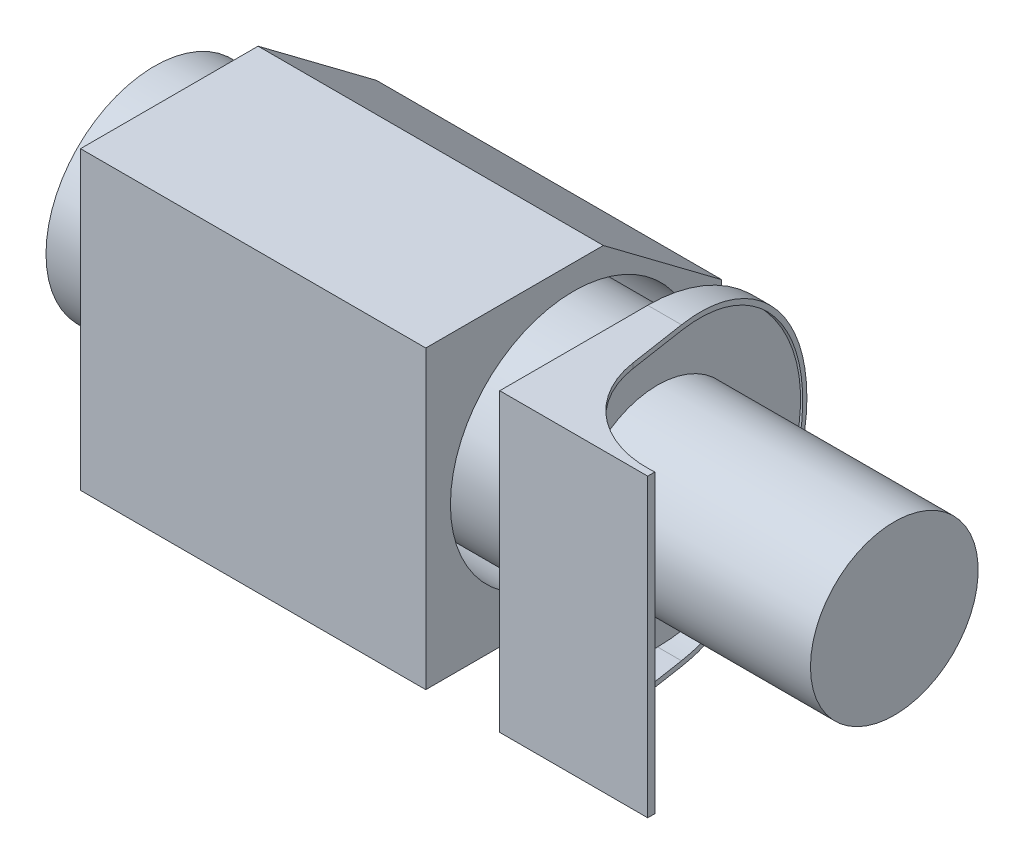
ISO-10303-21;
HEADER;
FILE_DESCRIPTION(('STEP AP214'),'2;1');
FILE_NAME('part.step','',(''),(''),'','','');
FILE_SCHEMA(('AUTOMOTIVE_DESIGN { 1 0 10303 214 1 1 1 1 }'));
ENDSEC;
DATA;
#1=APPLICATION_CONTEXT('core data for automotive mechanical design processes');
#2=APPLICATION_PROTOCOL_DEFINITION('international standard','automotive_design',2000,#1);
#3=PRODUCT_CONTEXT('',#1,'mechanical');
#4=PRODUCT('Part','Part','',(#3));
#5=PRODUCT_RELATED_PRODUCT_CATEGORY('part','',(#4));
#6=PRODUCT_DEFINITION_FORMATION('','',#4);
#7=PRODUCT_DEFINITION_CONTEXT('part definition',#1,'design');
#8=PRODUCT_DEFINITION('design','',#6,#7);
#9=PRODUCT_DEFINITION_SHAPE('','',#8);
#10=(LENGTH_UNIT() NAMED_UNIT(*) SI_UNIT(.MILLI.,.METRE.));
#11=(NAMED_UNIT(*) PLANE_ANGLE_UNIT() SI_UNIT($,.RADIAN.));
#12=(NAMED_UNIT(*) SI_UNIT($,.STERADIAN.) SOLID_ANGLE_UNIT());
#13=UNCERTAINTY_MEASURE_WITH_UNIT(LENGTH_MEASURE(1.E-05),#10,'distance_accuracy_value','');
#14=(GEOMETRIC_REPRESENTATION_CONTEXT(3) GLOBAL_UNCERTAINTY_ASSIGNED_CONTEXT((#13)) GLOBAL_UNIT_ASSIGNED_CONTEXT((#10,
#11,#12)) REPRESENTATION_CONTEXT('',''));
#15=CARTESIAN_POINT('',(0.,0.,0.));
#16=DIRECTION('',(0.,0.,1.));
#17=DIRECTION('',(1.,0.,0.));
#18=AXIS2_PLACEMENT_3D('',#15,#16,#17);
#19=CARTESIAN_POINT('',(-850.,0.,0.));
#20=DIRECTION('',(1.,0.,0.));
#21=DIRECTION('',(0.,0.,-1.));
#22=AXIS2_PLACEMENT_3D('',#19,#20,#21);
#23=PLANE('',#22);
#24=DIRECTION('',(0.,1.,0.));
#25=VECTOR('',#24,1.);
#26=CARTESIAN_POINT('',(-850.,600.,0.));
#27=LINE('',#26,#25);
#28=CARTESIAN_POINT('',(-850.,0.,0.));
#29=VERTEX_POINT('',#28);
#30=CARTESIAN_POINT('',(-850.,600.,0.));
#31=VERTEX_POINT('',#30);
#32=EDGE_CURVE('E140',#29,#31,#27,.T.);
#33=ORIENTED_EDGE('',*,*,#32,.T.);
#34=DIRECTION('',(0.,0.,-1.));
#35=VECTOR('',#34,1.);
#36=CARTESIAN_POINT('',(-850.,600.,0.));
#37=LINE('',#36,#35);
#38=CARTESIAN_POINT('',(-850.,600.,-360.));
#39=VERTEX_POINT('',#38);
#40=EDGE_CURVE('E98',#31,#39,#37,.T.);
#41=ORIENTED_EDGE('',*,*,#40,.T.);
#42=DIRECTION('',(0.,-0.6,-0.8));
#43=VECTOR('',#42,1.);
#44=CARTESIAN_POINT('',(-850.,600.,-360.));
#45=LINE('',#44,#43);
#46=CARTESIAN_POINT('',(-850.,420.,-600.));
#47=VERTEX_POINT('',#46);
#48=EDGE_CURVE('E111',#39,#47,#45,.T.);
#49=ORIENTED_EDGE('',*,*,#48,.T.);
#50=DIRECTION('',(0.,-1.,0.));
#51=VECTOR('',#50,1.);
#52=CARTESIAN_POINT('',(-850.,420.,-600.));
#53=LINE('',#52,#51);
#54=CARTESIAN_POINT('',(-850.,180.,-600.));
#55=VERTEX_POINT('',#54);
#56=EDGE_CURVE('E105',#47,#55,#53,.T.);
#57=ORIENTED_EDGE('',*,*,#56,.T.);
#58=DIRECTION('',(0.,-0.6,0.8));
#59=VECTOR('',#58,1.);
#60=CARTESIAN_POINT('',(-850.,0.,-360.));
#61=LINE('',#60,#59);
#62=CARTESIAN_POINT('',(-850.,0.,-360.));
#63=VERTEX_POINT('',#62);
#64=EDGE_CURVE('E109',#55,#63,#61,.T.);
#65=ORIENTED_EDGE('',*,*,#64,.T.);
#66=DIRECTION('',(0.,0.,1.));
#67=VECTOR('',#66,1.);
#68=CARTESIAN_POINT('',(-850.,0.,0.));
#69=LINE('',#68,#67);
#70=EDGE_CURVE('E61',#63,#29,#69,.T.);
#71=ORIENTED_EDGE('',*,*,#70,.T.);
#72=EDGE_LOOP('',(#33,#41,#49,#57,#65,#71));
#73=FACE_BOUND('',#72,.T.);
#74=CARTESIAN_POINT('',(-850.,300.,-300.));
#75=DIRECTION('',(-1.,0.,0.));
#76=DIRECTION('',(0.,0.,1.));
#77=AXIS2_PLACEMENT_3D('',#74,#75,#76);
#78=CIRCLE('',#77,250.);
#79=CARTESIAN_POINT('',(-850.,300.,-49.9999999999997));
#80=VERTEX_POINT('',#79);
#81=EDGE_CURVE('E133',#80,#80,#78,.T.);
#82=ORIENTED_EDGE('',*,*,#81,.F.);
#83=EDGE_LOOP('',(#82));
#84=FACE_BOUND('',#83,.T.);
#85=ADVANCED_FACE('F44',(#73,#84),#23,.F.);
#86=CARTESIAN_POINT('',(-150.,0.,0.));
#87=DIRECTION('',(1.,0.,0.));
#88=DIRECTION('',(0.,0.,-1.));
#89=AXIS2_PLACEMENT_3D('',#86,#87,#88);
#90=PLANE('',#89);
#91=DIRECTION('',(0.,1.,0.));
#92=VECTOR('',#91,1.);
#93=CARTESIAN_POINT('',(-150.,600.,0.));
#94=LINE('',#93,#92);
#95=CARTESIAN_POINT('',(-150.,0.,0.));
#96=VERTEX_POINT('',#95);
#97=CARTESIAN_POINT('',(-150.,600.,0.));
#98=VERTEX_POINT('',#97);
#99=EDGE_CURVE('E129',#96,#98,#94,.T.);
#100=ORIENTED_EDGE('',*,*,#99,.F.);
#101=DIRECTION('',(0.,0.,1.));
#102=VECTOR('',#101,1.);
#103=CARTESIAN_POINT('',(-150.,0.,0.));
#104=LINE('',#103,#102);
#105=CARTESIAN_POINT('',(-150.,0.,-360.));
#106=VERTEX_POINT('',#105);
#107=EDGE_CURVE('E90',#106,#96,#104,.T.);
#108=ORIENTED_EDGE('',*,*,#107,.F.);
#109=DIRECTION('',(0.,-0.6,0.8));
#110=VECTOR('',#109,1.);
#111=CARTESIAN_POINT('',(-150.,0.,-360.));
#112=LINE('',#111,#110);
#113=CARTESIAN_POINT('',(-150.,180.,-600.));
#114=VERTEX_POINT('',#113);
#115=EDGE_CURVE('E84',#114,#106,#112,.T.);
#116=ORIENTED_EDGE('',*,*,#115,.F.);
#117=DIRECTION('',(0.,-1.,0.));
#118=VECTOR('',#117,1.);
#119=CARTESIAN_POINT('',(-150.,420.,-600.));
#120=LINE('',#119,#118);
#121=CARTESIAN_POINT('',(-150.,420.,-600.));
#122=VERTEX_POINT('',#121);
#123=EDGE_CURVE('E119',#122,#114,#120,.T.);
#124=ORIENTED_EDGE('',*,*,#123,.F.);
#125=DIRECTION('',(0.,-0.6,-0.8));
#126=VECTOR('',#125,1.);
#127=CARTESIAN_POINT('',(-150.,600.,-360.));
#128=LINE('',#127,#126);
#129=CARTESIAN_POINT('',(-150.,600.,-360.));
#130=VERTEX_POINT('',#129);
#131=EDGE_CURVE('E135',#130,#122,#128,.T.);
#132=ORIENTED_EDGE('',*,*,#131,.F.);
#133=DIRECTION('',(0.,0.,-1.));
#134=VECTOR('',#133,1.);
#135=CARTESIAN_POINT('',(-150.,600.,0.));
#136=LINE('',#135,#134);
#137=EDGE_CURVE('E132',#98,#130,#136,.T.);
#138=ORIENTED_EDGE('',*,*,#137,.F.);
#139=EDGE_LOOP('',(#100,#108,#116,#124,#132,#138));
#140=FACE_BOUND('',#139,.T.);
#141=CARTESIAN_POINT('',(-150.,300.,-300.));
#142=DIRECTION('',(-1.,0.,0.));
#143=DIRECTION('',(0.,0.,1.));
#144=AXIS2_PLACEMENT_3D('',#141,#142,#143);
#145=CIRCLE('',#144,250.);
#146=CARTESIAN_POINT('',(-150.,300.,-49.9999999999997));
#147=VERTEX_POINT('',#146);
#148=EDGE_CURVE('E233',#147,#147,#145,.T.);
#149=ORIENTED_EDGE('',*,*,#148,.T.);
#150=EDGE_LOOP('',(#149));
#151=FACE_BOUND('',#150,.T.);
#152=ADVANCED_FACE('F149',(#140,#151),#90,.T.);
#153=CARTESIAN_POINT('',(-850.,600.,0.));
#154=DIRECTION('',(0.,0.,-1.));
#155=DIRECTION('',(-1.,0.,0.));
#156=AXIS2_PLACEMENT_3D('',#153,#154,#155);
#157=PLANE('',#156);
#158=ORIENTED_EDGE('',*,*,#99,.T.);
#159=DIRECTION('',(1.,0.,0.));
#160=VECTOR('',#159,1.);
#161=CARTESIAN_POINT('',(-850.,600.,0.));
#162=LINE('',#161,#160);
#163=EDGE_CURVE('E13',#31,#98,#162,.T.);
#164=ORIENTED_EDGE('',*,*,#163,.F.);
#165=ORIENTED_EDGE('',*,*,#32,.F.);
#166=DIRECTION('',(1.,0.,0.));
#167=VECTOR('',#166,1.);
#168=CARTESIAN_POINT('',(-850.,0.,0.));
#169=LINE('',#168,#167);
#170=EDGE_CURVE('E125',#29,#96,#169,.T.);
#171=ORIENTED_EDGE('',*,*,#170,.T.);
#172=EDGE_LOOP('',(#158,#164,#165,#171));
#173=FACE_BOUND('',#172,.T.);
#174=ADVANCED_FACE('F46',(#173),#157,.F.);
#175=CARTESIAN_POINT('',(-850.,600.,0.));
#176=DIRECTION('',(0.,-1.,0.));
#177=DIRECTION('',(0.,0.,-1.));
#178=AXIS2_PLACEMENT_3D('',#175,#176,#177);
#179=PLANE('',#178);
#180=ORIENTED_EDGE('',*,*,#137,.T.);
#181=DIRECTION('',(1.,0.,0.));
#182=VECTOR('',#181,1.);
#183=CARTESIAN_POINT('',(-850.,600.,-360.));
#184=LINE('',#183,#182);
#185=EDGE_CURVE('E53',#39,#130,#184,.T.);
#186=ORIENTED_EDGE('',*,*,#185,.F.);
#187=ORIENTED_EDGE('',*,*,#40,.F.);
#188=ORIENTED_EDGE('',*,*,#163,.T.);
#189=EDGE_LOOP('',(#180,#186,#187,#188));
#190=FACE_BOUND('',#189,.T.);
#191=ADVANCED_FACE('F174',(#190),#179,.F.);
#192=CARTESIAN_POINT('',(-850.,600.,-360.));
#193=DIRECTION('',(0.,-0.8,0.6));
#194=DIRECTION('',(0.,-0.6,-0.8));
#195=AXIS2_PLACEMENT_3D('',#192,#193,#194);
#196=PLANE('',#195);
#197=ORIENTED_EDGE('',*,*,#131,.T.);
#198=DIRECTION('',(1.,0.,0.));
#199=VECTOR('',#198,1.);
#200=CARTESIAN_POINT('',(-850.,420.,-600.));
#201=LINE('',#200,#199);
#202=EDGE_CURVE('E120',#47,#122,#201,.T.);
#203=ORIENTED_EDGE('',*,*,#202,.F.);
#204=ORIENTED_EDGE('',*,*,#48,.F.);
#205=ORIENTED_EDGE('',*,*,#185,.T.);
#206=EDGE_LOOP('',(#197,#203,#204,#205));
#207=FACE_BOUND('',#206,.T.);
#208=ADVANCED_FACE('F146',(#207),#196,.F.);
#209=CARTESIAN_POINT('',(-850.,420.,-600.));
#210=DIRECTION('',(0.,0.,1.));
#211=DIRECTION('',(0.,-1.,0.));
#212=AXIS2_PLACEMENT_3D('',#209,#210,#211);
#213=PLANE('',#212);
#214=ORIENTED_EDGE('',*,*,#123,.T.);
#215=DIRECTION('',(1.,0.,0.));
#216=VECTOR('',#215,1.);
#217=CARTESIAN_POINT('',(-850.,180.,-600.));
#218=LINE('',#217,#216);
#219=EDGE_CURVE('E116',#55,#114,#218,.T.);
#220=ORIENTED_EDGE('',*,*,#219,.F.);
#221=ORIENTED_EDGE('',*,*,#56,.F.);
#222=ORIENTED_EDGE('',*,*,#202,.T.);
#223=EDGE_LOOP('',(#214,#220,#221,#222));
#224=FACE_BOUND('',#223,.T.);
#225=ADVANCED_FACE('F117',(#224),#213,.F.);
#226=CARTESIAN_POINT('',(-850.,0.,-360.));
#227=DIRECTION('',(0.,0.8,0.6));
#228=DIRECTION('',(0.,-0.6,0.8));
#229=AXIS2_PLACEMENT_3D('',#226,#227,#228);
#230=PLANE('',#229);
#231=ORIENTED_EDGE('',*,*,#115,.T.);
#232=DIRECTION('',(1.,0.,0.));
#233=VECTOR('',#232,1.);
#234=CARTESIAN_POINT('',(-850.,0.,-360.));
#235=LINE('',#234,#233);
#236=EDGE_CURVE('E121',#63,#106,#235,.T.);
#237=ORIENTED_EDGE('',*,*,#236,.F.);
#238=ORIENTED_EDGE('',*,*,#64,.F.);
#239=ORIENTED_EDGE('',*,*,#219,.T.);
#240=EDGE_LOOP('',(#231,#237,#238,#239));
#241=FACE_BOUND('',#240,.T.);
#242=ADVANCED_FACE('F123',(#241),#230,.F.);
#243=CARTESIAN_POINT('',(-850.,0.,0.));
#244=DIRECTION('',(0.,1.,0.));
#245=DIRECTION('',(0.,0.,1.));
#246=AXIS2_PLACEMENT_3D('',#243,#244,#245);
#247=PLANE('',#246);
#248=ORIENTED_EDGE('',*,*,#107,.T.);
#249=ORIENTED_EDGE('',*,*,#170,.F.);
#250=ORIENTED_EDGE('',*,*,#70,.F.);
#251=ORIENTED_EDGE('',*,*,#236,.T.);
#252=EDGE_LOOP('',(#248,#249,#250,#251));
#253=FACE_BOUND('',#252,.T.);
#254=ADVANCED_FACE('F154',(#253),#247,.F.);
#255=CARTESIAN_POINT('',(-850.,300.,-300.));
#256=DIRECTION('',(1.,0.,0.));
#257=DIRECTION('',(0.,0.,-1.));
#258=AXIS2_PLACEMENT_3D('',#255,#256,#257);
#259=CYLINDRICAL_SURFACE('',#258,250.);
#260=ORIENTED_EDGE('',*,*,#81,.T.);
#261=EDGE_LOOP('',(#260));
#262=FACE_BOUND('',#261,.T.);
#263=ORIENTED_EDGE('',*,*,#148,.F.);
#264=EDGE_LOOP('',(#263));
#265=FACE_BOUND('',#264,.T.);
#266=ADVANCED_FACE('F156',(#262,#265),#259,.F.);
#267=CLOSED_SHELL('',(#85,#152,#174,#191,#208,#225,#242,#254,#266));
#268=MANIFOLD_SOLID_BREP('B2',#267);
#269=CARTESIAN_POINT('',(283.937651073963,600.,-213.94835788643));
#270=DIRECTION('',(0.,-1.,0.));
#271=DIRECTION('',(0.,0.,-1.));
#272=AXIS2_PLACEMENT_3D('',#269,#270,#271);
#273=CYLINDRICAL_SURFACE('',#272,200.);
#274=DIRECTION('',(0.,-1.,0.));
#275=VECTOR('',#274,1.);
#276=CARTESIAN_POINT('',(268.9388681595,600.,-14.5115595991412));
#277=LINE('',#276,#275);
#278=CARTESIAN_POINT('',(268.9388681595,10.,-14.5115595991412));
#279=VERTEX_POINT('',#278);
#280=CARTESIAN_POINT('',(268.9388681595,590.,-14.5115595991412));
#281=VERTEX_POINT('',#280);
#282=EDGE_CURVE('E347',#279,#281,#277,.F.);
#283=ORIENTED_EDGE('',*,*,#282,.T.);
#284=CARTESIAN_POINT('',(283.937651073963,590.,-213.94835788643));
#285=DIRECTION('',(0.,1.,0.));
#286=DIRECTION('',(0.,0.,1.));
#287=AXIS2_PLACEMENT_3D('',#284,#285,#286);
#288=CIRCLE('',#287,200.);
#289=CARTESIAN_POINT('',(86.2213483713176,590.,-183.810945164105));
#290=VERTEX_POINT('',#289);
#291=EDGE_CURVE('E366',#281,#290,#288,.F.);
#292=ORIENTED_EDGE('',*,*,#291,.T.);
#293=DIRECTION('',(0.,1.,0.));
#294=VECTOR('',#293,1.);
#295=CARTESIAN_POINT('',(86.2213483713176,600.,-183.810945164105));
#296=LINE('',#295,#294);
#297=CARTESIAN_POINT('',(86.2213483713176,600.,-183.810945164105));
#298=VERTEX_POINT('',#297);
#299=EDGE_CURVE('E465',#298,#290,#296,.F.);
#300=ORIENTED_EDGE('',*,*,#299,.F.);
#301=CARTESIAN_POINT('',(283.937651073963,600.,-213.94835788643));
#302=DIRECTION('',(0.,-1.,0.));
#303=DIRECTION('',(0.,0.,-1.));
#304=AXIS2_PLACEMENT_3D('',#301,#302,#303);
#305=CIRCLE('',#304,200.);
#306=CARTESIAN_POINT('',(291.234636381852,600.,-14.081517201397));
#307=VERTEX_POINT('',#306);
#308=EDGE_CURVE('E263',#298,#307,#305,.F.);
#309=ORIENTED_EDGE('',*,*,#308,.T.);
#310=DIRECTION('',(0.,-1.,0.));
#311=VECTOR('',#310,1.);
#312=CARTESIAN_POINT('',(291.234636381852,0.,-14.081517201397));
#313=LINE('',#312,#311);
#314=CARTESIAN_POINT('',(291.234636381852,0.,-14.081517201397));
#315=VERTEX_POINT('',#314);
#316=EDGE_CURVE('E468',#315,#307,#313,.F.);
#317=ORIENTED_EDGE('',*,*,#316,.F.);
#318=CARTESIAN_POINT('',(283.937651073963,0.,-213.94835788643));
#319=DIRECTION('',(0.,-1.,0.));
#320=DIRECTION('',(0.,0.,-1.));
#321=AXIS2_PLACEMENT_3D('',#318,#319,#320);
#322=CIRCLE('',#321,200.);
#323=CARTESIAN_POINT('',(86.2213483713176,0.,-183.810945164105));
#324=VERTEX_POINT('',#323);
#325=EDGE_CURVE('E381',#315,#324,#322,.T.);
#326=ORIENTED_EDGE('',*,*,#325,.T.);
#327=CARTESIAN_POINT('',(86.2213483713176,10.,-183.810945164105));
#328=VERTEX_POINT('',#327);
#329=EDGE_CURVE('E464',#328,#324,#296,.F.);
#330=ORIENTED_EDGE('',*,*,#329,.F.);
#331=CARTESIAN_POINT('',(283.937651073963,10.,-213.94835788643));
#332=DIRECTION('',(0.,-1.,0.));
#333=DIRECTION('',(0.,0.,-1.));
#334=AXIS2_PLACEMENT_3D('',#331,#332,#333);
#335=CIRCLE('',#334,200.);
#336=EDGE_CURVE('E255',#328,#279,#335,.F.);
#337=ORIENTED_EDGE('',*,*,#336,.T.);
#338=EDGE_LOOP('',(#283,#292,#300,#309,#317,#326,#330,#337));
#339=FACE_BOUND('',#338,.T.);
#340=ADVANCED_FACE('F241',(#339),#273,.F.);
#341=CARTESIAN_POINT('',(0.,600.,0.));
#342=DIRECTION('',(-1.,0.,0.));
#343=DIRECTION('',(0.,0.,1.));
#344=AXIS2_PLACEMENT_3D('',#341,#342,#343);
#345=PLANE('',#344);
#346=CARTESIAN_POINT('',(0.,300.,-300.));
#347=DIRECTION('',(-1.,0.,0.));
#348=DIRECTION('',(0.,0.,1.));
#349=AXIS2_PLACEMENT_3D('',#346,#347,#348);
#350=CIRCLE('',#349,220.);
#351=CARTESIAN_POINT('',(0.,300.,-79.9999999999997));
#352=VERTEX_POINT('',#351);
#353=EDGE_CURVE('E377',#352,#352,#350,.T.);
#354=ORIENTED_EDGE('',*,*,#353,.F.);
#355=EDGE_LOOP('',(#354));
#356=FACE_BOUND('',#355,.T.);
#357=DIRECTION('',(0.,0.,-1.));
#358=VECTOR('',#357,1.);
#359=CARTESIAN_POINT('',(0.,600.,0.));
#360=LINE('',#359,#358);
#361=CARTESIAN_POINT('',(0.,600.,0.));
#362=VERTEX_POINT('',#361);
#363=CARTESIAN_POINT('',(0.,600.,-300.));
#364=VERTEX_POINT('',#363);
#365=EDGE_CURVE('E432',#362,#364,#360,.T.);
#366=ORIENTED_EDGE('',*,*,#365,.T.);
#367=CARTESIAN_POINT('',(0.,300.,-300.));
#368=DIRECTION('',(-1.,0.,0.));
#369=DIRECTION('',(0.,0.,1.));
#370=AXIS2_PLACEMENT_3D('',#367,#368,#369);
#371=CIRCLE('',#370,300.);
#372=CARTESIAN_POINT('',(0.,0.,-300.));
#373=VERTEX_POINT('',#372);
#374=EDGE_CURVE('E435',#364,#373,#371,.T.);
#375=ORIENTED_EDGE('',*,*,#374,.T.);
#376=DIRECTION('',(0.,0.,-1.));
#377=VECTOR('',#376,1.);
#378=CARTESIAN_POINT('',(0.,0.,0.));
#379=LINE('',#378,#377);
#380=CARTESIAN_POINT('',(0.,0.,0.));
#381=VERTEX_POINT('',#380);
#382=EDGE_CURVE('E453',#381,#373,#379,.T.);
#383=ORIENTED_EDGE('',*,*,#382,.F.);
#384=DIRECTION('',(0.,-1.,0.));
#385=VECTOR('',#384,1.);
#386=CARTESIAN_POINT('',(0.,600.,0.));
#387=LINE('',#386,#385);
#388=EDGE_CURVE('E437',#362,#381,#387,.T.);
#389=ORIENTED_EDGE('',*,*,#388,.F.);
#390=EDGE_LOOP('',(#366,#375,#383,#389));
#391=FACE_BOUND('',#390,.T.);
#392=ADVANCED_FACE('F420',(#356,#391),#345,.T.);
#393=CARTESIAN_POINT('',(300.,600.,0.));
#394=DIRECTION('',(-1.,0.,0.));
#395=DIRECTION('',(0.,0.,1.));
#396=AXIS2_PLACEMENT_3D('',#393,#394,#395);
#397=PLANE('',#396);
#398=DIRECTION('',(0.,0.,-1.));
#399=VECTOR('',#398,1.);
#400=CARTESIAN_POINT('',(300.,0.,0.));
#401=LINE('',#400,#399);
#402=CARTESIAN_POINT('',(300.,0.,0.));
#403=VERTEX_POINT('',#402);
#404=CARTESIAN_POINT('',(300.,0.,-14.5115595991412));
#405=VERTEX_POINT('',#404);
#406=EDGE_CURVE('E445',#403,#405,#401,.T.);
#407=ORIENTED_EDGE('',*,*,#406,.T.);
#408=DIRECTION('',(0.,-1.,0.));
#409=VECTOR('',#408,1.);
#410=CARTESIAN_POINT('',(300.,600.,-14.5115595991412));
#411=LINE('',#410,#409);
#412=CARTESIAN_POINT('',(300.,600.,-14.5115595991412));
#413=VERTEX_POINT('',#412);
#414=EDGE_CURVE('E490',#413,#405,#411,.T.);
#415=ORIENTED_EDGE('',*,*,#414,.F.);
#416=DIRECTION('',(0.,0.,-1.));
#417=VECTOR('',#416,1.);
#418=CARTESIAN_POINT('',(300.,600.,0.));
#419=LINE('',#418,#417);
#420=CARTESIAN_POINT('',(300.,600.,0.));
#421=VERTEX_POINT('',#420);
#422=EDGE_CURVE('E439',#421,#413,#419,.T.);
#423=ORIENTED_EDGE('',*,*,#422,.F.);
#424=DIRECTION('',(0.,-1.,0.));
#425=VECTOR('',#424,1.);
#426=CARTESIAN_POINT('',(300.,600.,0.));
#427=LINE('',#426,#425);
#428=EDGE_CURVE('E452',#421,#403,#427,.T.);
#429=ORIENTED_EDGE('',*,*,#428,.T.);
#430=EDGE_LOOP('',(#407,#415,#423,#429));
#431=FACE_BOUND('',#430,.T.);
#432=ADVANCED_FACE('F417',(#431),#397,.F.);
#433=CARTESIAN_POINT('',(0.,600.,0.));
#434=DIRECTION('',(0.,0.,-1.));
#435=DIRECTION('',(-1.,0.,0.));
#436=AXIS2_PLACEMENT_3D('',#433,#434,#435);
#437=PLANE('',#436);
#438=DIRECTION('',(1.,0.,0.));
#439=VECTOR('',#438,1.);
#440=CARTESIAN_POINT('',(0.,0.,0.));
#441=LINE('',#440,#439);
#442=EDGE_CURVE('E440',#381,#403,#441,.T.);
#443=ORIENTED_EDGE('',*,*,#442,.T.);
#444=ORIENTED_EDGE('',*,*,#428,.F.);
#445=DIRECTION('',(1.,0.,0.));
#446=VECTOR('',#445,1.);
#447=CARTESIAN_POINT('',(0.,600.,0.));
#448=LINE('',#447,#446);
#449=EDGE_CURVE('E443',#362,#421,#448,.T.);
#450=ORIENTED_EDGE('',*,*,#449,.F.);
#451=ORIENTED_EDGE('',*,*,#388,.T.);
#452=EDGE_LOOP('',(#443,#444,#450,#451));
#453=FACE_BOUND('',#452,.T.);
#454=ADVANCED_FACE('F410',(#453),#437,.F.);
#455=CARTESIAN_POINT('',(0.,600.,0.));
#456=DIRECTION('',(0.,-1.,0.));
#457=DIRECTION('',(0.,0.,-1.));
#458=AXIS2_PLACEMENT_3D('',#455,#456,#457);
#459=PLANE('',#458);
#460=ORIENTED_EDGE('',*,*,#308,.F.);
#461=DIRECTION('',(-0.150687063611626,0.,-0.988581513513229));
#462=VECTOR('',#461,1.);
#463=CARTESIAN_POINT('',(97.9148013831669,600.,-107.096121744068));
#464=LINE('',#463,#462);
#465=CARTESIAN_POINT('',(68.5109347557419,600.,-300.));
#466=VERTEX_POINT('',#465);
#467=EDGE_CURVE('E388',#298,#466,#464,.T.);
#468=ORIENTED_EDGE('',*,*,#467,.T.);
#469=DIRECTION('',(-1.,0.,0.));
#470=VECTOR('',#469,1.);
#471=CARTESIAN_POINT('',(300.,600.,-300.));
#472=LINE('',#471,#470);
#473=EDGE_CURVE('E448',#466,#364,#472,.T.);
#474=ORIENTED_EDGE('',*,*,#473,.T.);
#475=ORIENTED_EDGE('',*,*,#365,.F.);
#476=ORIENTED_EDGE('',*,*,#449,.T.);
#477=ORIENTED_EDGE('',*,*,#422,.T.);
#478=CARTESIAN_POINT('',(300.,600.,-14.5115595991412));
#479=CARTESIAN_POINT('',(162.264361076892,600.,-6.0546959837281));
#480=CARTESIAN_POINT('',(97.9148013831669,600.,-107.096121744068));
#481=B_SPLINE_CURVE_WITH_KNOTS('',2,(#478,#479,#480),.UNSPECIFIED.,.F.,.F.,(3,3),(0.,1.),.UNSPECIFIED.);
#482=EDGE_CURVE('E382',#413,#307,#481,.T.);
#483=ORIENTED_EDGE('',*,*,#482,.T.);
#484=EDGE_LOOP('',(#460,#468,#474,#475,#476,#477,#483));
#485=FACE_BOUND('',#484,.T.);
#486=ADVANCED_FACE('F407',(#485),#459,.F.);
#487=CARTESIAN_POINT('',(0.,0.,0.));
#488=DIRECTION('',(0.,-1.,0.));
#489=DIRECTION('',(0.,0.,-1.));
#490=AXIS2_PLACEMENT_3D('',#487,#488,#489);
#491=PLANE('',#490);
#492=CARTESIAN_POINT('',(300.,0.,-14.5115595991412));
#493=CARTESIAN_POINT('',(162.264361076892,0.,-6.0546959837281));
#494=CARTESIAN_POINT('',(97.9148013831669,0.,-107.096121744068));
#495=B_SPLINE_CURVE_WITH_KNOTS('',2,(#492,#493,#494),.UNSPECIFIED.,.F.,.F.,(3,3),(0.,1.),.UNSPECIFIED.);
#496=EDGE_CURVE('E376',#405,#315,#495,.T.);
#497=ORIENTED_EDGE('',*,*,#496,.F.);
#498=ORIENTED_EDGE('',*,*,#406,.F.);
#499=ORIENTED_EDGE('',*,*,#442,.F.);
#500=ORIENTED_EDGE('',*,*,#382,.T.);
#501=DIRECTION('',(-1.,0.,0.));
#502=VECTOR('',#501,1.);
#503=CARTESIAN_POINT('',(300.,0.,-300.));
#504=LINE('',#503,#502);
#505=CARTESIAN_POINT('',(68.5109347557419,0.,-300.));
#506=VERTEX_POINT('',#505);
#507=EDGE_CURVE('E455',#506,#373,#504,.T.);
#508=ORIENTED_EDGE('',*,*,#507,.F.);
#509=DIRECTION('',(-0.150687063611626,0.,-0.988581513513229));
#510=VECTOR('',#509,1.);
#511=CARTESIAN_POINT('',(97.9148013831669,0.,-107.096121744068));
#512=LINE('',#511,#510);
#513=EDGE_CURVE('E389',#324,#506,#512,.T.);
#514=ORIENTED_EDGE('',*,*,#513,.F.);
#515=ORIENTED_EDGE('',*,*,#325,.F.);
#516=EDGE_LOOP('',(#497,#498,#499,#500,#508,#514,#515));
#517=FACE_BOUND('',#516,.T.);
#518=ADVANCED_FACE('F405',(#517),#491,.T.);
#519=CARTESIAN_POINT('',(300.,300.,-300.));
#520=DIRECTION('',(-1.,0.,0.));
#521=DIRECTION('',(0.,0.,1.));
#522=AXIS2_PLACEMENT_3D('',#519,#520,#521);
#523=CYLINDRICAL_SURFACE('',#522,300.);
#524=ORIENTED_EDGE('',*,*,#473,.F.);
#525=CARTESIAN_POINT('',(68.5109347557419,300.,-300.));
#526=DIRECTION('',(-0.988581513513229,0.,0.150687063611626));
#527=DIRECTION('',(-0.150687063611626,0.,-0.988581513513229));
#528=AXIS2_PLACEMENT_3D('',#525,#526,#527);
#529=ELLIPSE('',#528,303.465112283819,300.);
#530=EDGE_CURVE('E459',#506,#466,#529,.F.);
#531=ORIENTED_EDGE('',*,*,#530,.F.);
#532=ORIENTED_EDGE('',*,*,#507,.T.);
#533=ORIENTED_EDGE('',*,*,#374,.F.);
#534=EDGE_LOOP('',(#524,#531,#532,#533));
#535=FACE_BOUND('',#534,.T.);
#536=ADVANCED_FACE('F400',(#535),#523,.T.);
#537=DIRECTION('',(0.,-1.,0.));
#538=VECTOR('',#537,1.);
#539=SURFACE_OF_LINEAR_EXTRUSION('',#481,#538);
#540=ORIENTED_EDGE('',*,*,#496,.T.);
#541=ORIENTED_EDGE('',*,*,#316,.T.);
#542=ORIENTED_EDGE('',*,*,#482,.F.);
#543=ORIENTED_EDGE('',*,*,#414,.T.);
#544=EDGE_LOOP('',(#540,#541,#542,#543));
#545=FACE_BOUND('',#544,.T.);
#546=ADVANCED_FACE('F395',(#545),#539,.F.);
#547=CARTESIAN_POINT('',(97.9148013831669,600.,-107.096121744068));
#548=DIRECTION('',(-0.988581513513229,0.,0.150687063611626));
#549=DIRECTION('',(0.150687063611626,0.,0.988581513513229));
#550=AXIS2_PLACEMENT_3D('',#547,#548,#549);
#551=PLANE('',#550);
#552=ORIENTED_EDGE('',*,*,#299,.T.);
#553=DIRECTION('',(-0.150687063611626,0.,-0.988581513513229));
#554=VECTOR('',#553,1.);
#555=CARTESIAN_POINT('',(97.9148013831669,590.,-107.096121744068));
#556=LINE('',#555,#554);
#557=CARTESIAN_POINT('',(68.5109347557419,590.,-300.));
#558=VERTEX_POINT('',#557);
#559=EDGE_CURVE('E42',#290,#558,#556,.T.);
#560=ORIENTED_EDGE('',*,*,#559,.T.);
#561=CARTESIAN_POINT('',(68.5109347557419,300.,-300.));
#562=DIRECTION('',(-0.988581513513229,0.,0.150687063611626));
#563=DIRECTION('',(0.150687063611626,0.,0.988581513513229));
#564=AXIS2_PLACEMENT_3D('',#561,#562,#563);
#565=ELLIPSE('',#564,293.349608541025,290.);
#566=CARTESIAN_POINT('',(68.5109347557419,10.,-300.));
#567=VERTEX_POINT('',#566);
#568=EDGE_CURVE('E248',#558,#567,#565,.T.);
#569=ORIENTED_EDGE('',*,*,#568,.T.);
#570=DIRECTION('',(0.150687063611626,0.,0.988581513513229));
#571=VECTOR('',#570,1.);
#572=CARTESIAN_POINT('',(97.9148013831669,10.,-107.096121744068));
#573=LINE('',#572,#571);
#574=EDGE_CURVE('E380',#567,#328,#573,.T.);
#575=ORIENTED_EDGE('',*,*,#574,.T.);
#576=ORIENTED_EDGE('',*,*,#329,.T.);
#577=ORIENTED_EDGE('',*,*,#513,.T.);
#578=ORIENTED_EDGE('',*,*,#530,.T.);
#579=ORIENTED_EDGE('',*,*,#467,.F.);
#580=EDGE_LOOP('',(#552,#560,#569,#575,#576,#577,#578,#579));
#581=FACE_BOUND('',#580,.T.);
#582=ADVANCED_FACE('F399',(#581),#551,.F.);
#583=CARTESIAN_POINT('',(-1000.,300.,-300.));
#584=DIRECTION('',(1.,0.,0.));
#585=DIRECTION('',(0.,0.,-1.));
#586=AXIS2_PLACEMENT_3D('',#583,#584,#585);
#587=CYLINDRICAL_SURFACE('',#586,220.);
#588=CARTESIAN_POINT('',(-1000.,300.,-300.));
#589=DIRECTION('',(-1.,0.,0.));
#590=DIRECTION('',(0.,0.,1.));
#591=AXIS2_PLACEMENT_3D('',#588,#589,#590);
#592=CIRCLE('',#591,220.);
#593=CARTESIAN_POINT('',(-1000.,300.,-79.9999999999997));
#594=VERTEX_POINT('',#593);
#595=EDGE_CURVE('E373',#594,#594,#592,.T.);
#596=ORIENTED_EDGE('',*,*,#595,.F.);
#597=EDGE_LOOP('',(#596));
#598=FACE_BOUND('',#597,.T.);
#599=ORIENTED_EDGE('',*,*,#353,.T.);
#600=EDGE_LOOP('',(#599));
#601=FACE_BOUND('',#600,.T.);
#602=ADVANCED_FACE('F523',(#598,#601),#587,.T.);
#603=CARTESIAN_POINT('',(-1000.,300.,-300.));
#604=DIRECTION('',(-1.,0.,0.));
#605=DIRECTION('',(0.,0.,1.));
#606=AXIS2_PLACEMENT_3D('',#603,#604,#605);
#607=PLANE('',#606);
#608=ORIENTED_EDGE('',*,*,#595,.T.);
#609=EDGE_LOOP('',(#608));
#610=FACE_BOUND('',#609,.T.);
#611=ADVANCED_FACE('F508',(#610),#607,.T.);
#612=CARTESIAN_POINT('',(19.9999999999998,300.,-14.5115595991413));
#613=DIRECTION('',(0.,0.,1.));
#614=DIRECTION('',(1.,0.,0.));
#615=AXIS2_PLACEMENT_3D('',#612,#613,#614);
#616=PLANE('',#615);
#617=DIRECTION('',(1.,0.,0.));
#618=VECTOR('',#617,1.);
#619=CARTESIAN_POINT('',(19.9999999999998,10.,-14.5115595991413));
#620=LINE('',#619,#618);
#621=CARTESIAN_POINT('',(19.9999999999998,10.,-14.5115595991413));
#622=VERTEX_POINT('',#621);
#623=EDGE_CURVE('E344',#622,#279,#620,.T.);
#624=ORIENTED_EDGE('',*,*,#623,.F.);
#625=DIRECTION('',(0.,-1.,0.));
#626=VECTOR('',#625,1.);
#627=CARTESIAN_POINT('',(19.9999999999998,300.,-14.5115595991413));
#628=LINE('',#627,#626);
#629=CARTESIAN_POINT('',(19.9999999999998,590.,-14.5115595991413));
#630=VERTEX_POINT('',#629);
#631=EDGE_CURVE('E332',#630,#622,#628,.T.);
#632=ORIENTED_EDGE('',*,*,#631,.F.);
#633=DIRECTION('',(1.,0.,0.));
#634=VECTOR('',#633,1.);
#635=CARTESIAN_POINT('',(19.9999999999998,590.,-14.5115595991413));
#636=LINE('',#635,#634);
#637=EDGE_CURVE('E359',#630,#281,#636,.T.);
#638=ORIENTED_EDGE('',*,*,#637,.T.);
#639=ORIENTED_EDGE('',*,*,#282,.F.);
#640=EDGE_LOOP('',(#624,#632,#638,#639));
#641=FACE_BOUND('',#640,.T.);
#642=ADVANCED_FACE('F345',(#641),#616,.F.);
#643=CARTESIAN_POINT('',(19.9999999999999,590.,-300.));
#644=DIRECTION('',(0.,1.,0.));
#645=DIRECTION('',(0.,0.,1.));
#646=AXIS2_PLACEMENT_3D('',#643,#644,#645);
#647=PLANE('',#646);
#648=ORIENTED_EDGE('',*,*,#637,.F.);
#649=DIRECTION('',(0.,0.,1.));
#650=VECTOR('',#649,1.);
#651=CARTESIAN_POINT('',(19.9999999999999,590.,-300.));
#652=LINE('',#651,#650);
#653=CARTESIAN_POINT('',(19.9999999999999,590.,-300.));
#654=VERTEX_POINT('',#653);
#655=EDGE_CURVE('E339',#654,#630,#652,.T.);
#656=ORIENTED_EDGE('',*,*,#655,.F.);
#657=DIRECTION('',(1.,0.,0.));
#658=VECTOR('',#657,1.);
#659=CARTESIAN_POINT('',(19.9999999999999,590.,-300.));
#660=LINE('',#659,#658);
#661=EDGE_CURVE('E361',#654,#558,#660,.T.);
#662=ORIENTED_EDGE('',*,*,#661,.T.);
#663=ORIENTED_EDGE('',*,*,#559,.F.);
#664=ORIENTED_EDGE('',*,*,#291,.F.);
#665=EDGE_LOOP('',(#648,#656,#662,#663,#664));
#666=FACE_BOUND('',#665,.T.);
#667=ADVANCED_FACE('F479',(#666),#647,.F.);
#668=CARTESIAN_POINT('',(19.9999999999999,300.,-300.));
#669=DIRECTION('',(1.,0.,0.));
#670=DIRECTION('',(0.,0.,-1.));
#671=AXIS2_PLACEMENT_3D('',#668,#669,#670);
#672=CYLINDRICAL_SURFACE('',#671,290.);
#673=ORIENTED_EDGE('',*,*,#661,.F.);
#674=CARTESIAN_POINT('',(19.9999999999999,300.,-300.));
#675=DIRECTION('',(1.,0.,0.));
#676=DIRECTION('',(0.,0.,-1.));
#677=AXIS2_PLACEMENT_3D('',#674,#675,#676);
#678=CIRCLE('',#677,290.);
#679=CARTESIAN_POINT('',(19.9999999999999,10.0000000000001,-300.));
#680=VERTEX_POINT('',#679);
#681=EDGE_CURVE('E353',#680,#654,#678,.T.);
#682=ORIENTED_EDGE('',*,*,#681,.F.);
#683=DIRECTION('',(1.,0.,0.));
#684=VECTOR('',#683,1.);
#685=CARTESIAN_POINT('',(19.9999999999999,10.0000000000001,-300.));
#686=LINE('',#685,#684);
#687=EDGE_CURVE('E348',#680,#567,#686,.T.);
#688=ORIENTED_EDGE('',*,*,#687,.T.);
#689=ORIENTED_EDGE('',*,*,#568,.F.);
#690=EDGE_LOOP('',(#673,#682,#688,#689));
#691=FACE_BOUND('',#690,.T.);
#692=ADVANCED_FACE('F477',(#691),#672,.F.);
#693=CARTESIAN_POINT('',(19.9999999999999,10.,-300.));
#694=DIRECTION('',(0.,-1.,0.));
#695=DIRECTION('',(0.,0.,-1.));
#696=AXIS2_PLACEMENT_3D('',#693,#694,#695);
#697=PLANE('',#696);
#698=ORIENTED_EDGE('',*,*,#574,.F.);
#699=ORIENTED_EDGE('',*,*,#687,.F.);
#700=DIRECTION('',(0.,0.,-1.));
#701=VECTOR('',#700,1.);
#702=CARTESIAN_POINT('',(19.9999999999999,10.,-300.));
#703=LINE('',#702,#701);
#704=EDGE_CURVE('E337',#622,#680,#703,.T.);
#705=ORIENTED_EDGE('',*,*,#704,.F.);
#706=ORIENTED_EDGE('',*,*,#623,.T.);
#707=ORIENTED_EDGE('',*,*,#336,.F.);
#708=EDGE_LOOP('',(#698,#699,#705,#706,#707));
#709=FACE_BOUND('',#708,.T.);
#710=ADVANCED_FACE('F350',(#709),#697,.F.);
#711=CARTESIAN_POINT('',(19.9999999999999,300.,-300.));
#712=DIRECTION('',(1.,0.,0.));
#713=DIRECTION('',(0.,0.,-1.));
#714=AXIS2_PLACEMENT_3D('',#711,#712,#713);
#715=PLANE('',#714);
#716=CARTESIAN_POINT('',(19.9999999999999,300.,-300.));
#717=DIRECTION('',(1.,0.,0.));
#718=DIRECTION('',(0.,0.,-1.));
#719=AXIS2_PLACEMENT_3D('',#716,#717,#718);
#720=CIRCLE('',#719,170.);
#721=CARTESIAN_POINT('',(20.,300.,-470.));
#722=VERTEX_POINT('',#721);
#723=EDGE_CURVE('E342',#722,#722,#720,.T.);
#724=ORIENTED_EDGE('',*,*,#723,.F.);
#725=EDGE_LOOP('',(#724));
#726=FACE_BOUND('',#725,.T.);
#727=ORIENTED_EDGE('',*,*,#631,.T.);
#728=ORIENTED_EDGE('',*,*,#704,.T.);
#729=ORIENTED_EDGE('',*,*,#681,.T.);
#730=ORIENTED_EDGE('',*,*,#655,.T.);
#731=EDGE_LOOP('',(#727,#728,#729,#730));
#732=FACE_BOUND('',#731,.T.);
#733=ADVANCED_FACE('F334',(#726,#732),#715,.T.);
#734=CARTESIAN_POINT('',(500.,300.,-300.));
#735=DIRECTION('',(-1.,0.,0.));
#736=DIRECTION('',(0.,0.,1.));
#737=AXIS2_PLACEMENT_3D('',#734,#735,#736);
#738=PLANE('',#737);
#739=CARTESIAN_POINT('',(500.,300.,-300.));
#740=DIRECTION('',(-1.,0.,0.));
#741=DIRECTION('',(0.,0.,1.));
#742=AXIS2_PLACEMENT_3D('',#739,#740,#741);
#743=CIRCLE('',#742,170.);
#744=CARTESIAN_POINT('',(500.,300.,-130.));
#745=VERTEX_POINT('',#744);
#746=EDGE_CURVE('E370',#745,#745,#743,.T.);
#747=ORIENTED_EDGE('',*,*,#746,.F.);
#748=EDGE_LOOP('',(#747));
#749=FACE_BOUND('',#748,.T.);
#750=ADVANCED_FACE('F514',(#749),#738,.F.);
#751=CARTESIAN_POINT('',(500.,300.,-300.));
#752=DIRECTION('',(-1.,0.,0.));
#753=DIRECTION('',(0.,0.,1.));
#754=AXIS2_PLACEMENT_3D('',#751,#752,#753);
#755=CYLINDRICAL_SURFACE('',#754,170.);
#756=ORIENTED_EDGE('',*,*,#746,.T.);
#757=EDGE_LOOP('',(#756));
#758=FACE_BOUND('',#757,.T.);
#759=ORIENTED_EDGE('',*,*,#723,.T.);
#760=EDGE_LOOP('',(#759));
#761=FACE_BOUND('',#760,.T.);
#762=ADVANCED_FACE('F517',(#758,#761),#755,.T.);
#763=CLOSED_SHELL('',(#340,#392,#432,#454,#486,#518,#536,#546,#582,#602,#611,#642,#667,#692,
#710,#733,#750,#762));
#764=MANIFOLD_SOLID_BREP('B7',#763);
#765=ADVANCED_BREP_SHAPE_REPRESENTATION('',(#18,#268,#764),#14);
#766=SHAPE_DEFINITION_REPRESENTATION(#9,#765);
ENDSEC;
END-ISO-10303-21;
